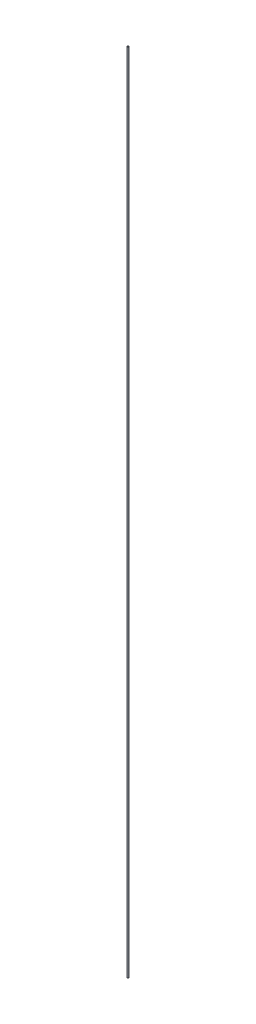
ISO-10303-21;
HEADER;
FILE_DESCRIPTION(('STEP AP214'),'2;1');
FILE_NAME('part.step','',(''),(''),'','','');
FILE_SCHEMA(('AUTOMOTIVE_DESIGN { 1 0 10303 214 1 1 1 1 }'));
ENDSEC;
DATA;
#1=APPLICATION_CONTEXT('core data for automotive mechanical design processes');
#2=APPLICATION_PROTOCOL_DEFINITION('international standard','automotive_design',2000,#1);
#3=PRODUCT_CONTEXT('',#1,'mechanical');
#4=PRODUCT('Part','Part','',(#3));
#5=PRODUCT_RELATED_PRODUCT_CATEGORY('part','',(#4));
#6=PRODUCT_DEFINITION_FORMATION('','',#4);
#7=PRODUCT_DEFINITION_CONTEXT('part definition',#1,'design');
#8=PRODUCT_DEFINITION('design','',#6,#7);
#9=PRODUCT_DEFINITION_SHAPE('','',#8);
#10=(LENGTH_UNIT() NAMED_UNIT(*) SI_UNIT(.MILLI.,.METRE.));
#11=(NAMED_UNIT(*) PLANE_ANGLE_UNIT() SI_UNIT($,.RADIAN.));
#12=(NAMED_UNIT(*) SI_UNIT($,.STERADIAN.) SOLID_ANGLE_UNIT());
#13=UNCERTAINTY_MEASURE_WITH_UNIT(LENGTH_MEASURE(1.E-05),#10,'distance_accuracy_value','');
#14=(GEOMETRIC_REPRESENTATION_CONTEXT(3) GLOBAL_UNCERTAINTY_ASSIGNED_CONTEXT((#13)) GLOBAL_UNIT_ASSIGNED_CONTEXT((#10,
#11,#12)) REPRESENTATION_CONTEXT('',''));
#15=CARTESIAN_POINT('',(0.,0.,0.));
#16=DIRECTION('',(0.,0.,1.));
#17=DIRECTION('',(1.,0.,0.));
#18=AXIS2_PLACEMENT_3D('',#15,#16,#17);
#19=CARTESIAN_POINT('',(0.,0.,0.));
#20=DIRECTION('',(0.,1.,0.));
#21=DIRECTION('',(0.,0.,1.));
#22=AXIS2_PLACEMENT_3D('',#19,#20,#21);
#23=PLANE('',#22);
#24=CARTESIAN_POINT('',(0.,0.,0.));
#25=DIRECTION('',(0.,1.,0.));
#26=DIRECTION('',(0.,0.,1.));
#27=AXIS2_PLACEMENT_3D('',#24,#25,#26);
#28=CIRCLE('',#27,6.35);
#29=CARTESIAN_POINT('',(0.,0.,6.35));
#30=VERTEX_POINT('',#29);
#31=EDGE_CURVE('E48',#30,#30,#28,.T.);
#32=ORIENTED_EDGE('',*,*,#31,.F.);
#33=EDGE_LOOP('',(#32));
#34=FACE_BOUND('',#33,.T.);
#35=ADVANCED_FACE('F42',(#34),#23,.F.);
#36=CARTESIAN_POINT('',(0.,8215.884,0.));
#37=DIRECTION('',(0.,1.,0.));
#38=DIRECTION('',(0.,0.,1.));
#39=AXIS2_PLACEMENT_3D('',#36,#37,#38);
#40=PLANE('',#39);
#41=CARTESIAN_POINT('',(0.,8215.884,0.));
#42=DIRECTION('',(0.,1.,0.));
#43=DIRECTION('',(0.,0.,1.));
#44=AXIS2_PLACEMENT_3D('',#41,#42,#43);
#45=CIRCLE('',#44,6.35);
#46=CARTESIAN_POINT('',(0.,8215.884,6.35));
#47=VERTEX_POINT('',#46);
#48=EDGE_CURVE('E11',#47,#47,#45,.T.);
#49=ORIENTED_EDGE('',*,*,#48,.T.);
#50=EDGE_LOOP('',(#49));
#51=FACE_BOUND('',#50,.T.);
#52=ADVANCED_FACE('F57',(#51),#40,.T.);
#53=CARTESIAN_POINT('',(0.,0.,0.));
#54=DIRECTION('',(0.,1.,0.));
#55=DIRECTION('',(0.,0.,1.));
#56=AXIS2_PLACEMENT_3D('',#53,#54,#55);
#57=CYLINDRICAL_SURFACE('',#56,6.35);
#58=ORIENTED_EDGE('',*,*,#48,.F.);
#59=EDGE_LOOP('',(#58));
#60=FACE_BOUND('',#59,.T.);
#61=ORIENTED_EDGE('',*,*,#31,.T.);
#62=EDGE_LOOP('',(#61));
#63=FACE_BOUND('',#62,.T.);
#64=ADVANCED_FACE('F54',(#60,#63),#57,.T.);
#65=CLOSED_SHELL('',(#35,#52,#64));
#66=MANIFOLD_SOLID_BREP('B2',#65);
#67=ADVANCED_BREP_SHAPE_REPRESENTATION('',(#18,#66),#14);
#68=SHAPE_DEFINITION_REPRESENTATION(#9,#67);
ENDSEC;
END-ISO-10303-21;
